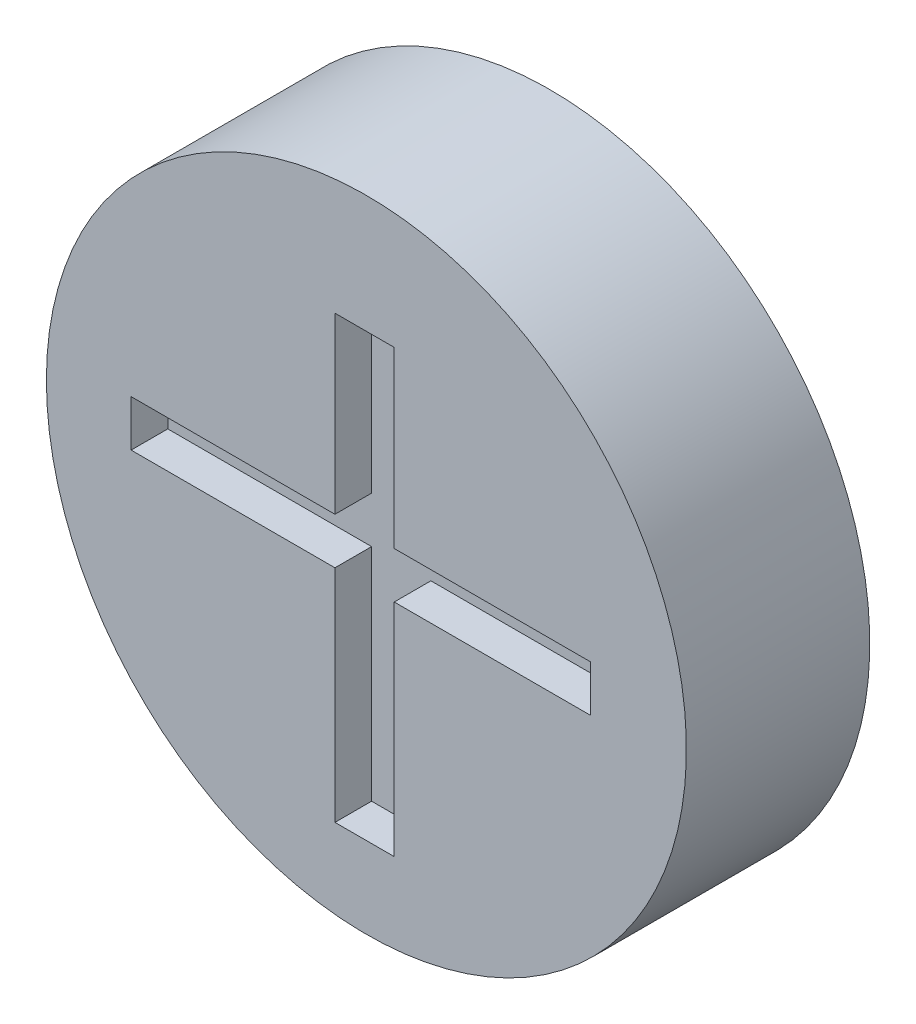
ISO-10303-21;
HEADER;
FILE_DESCRIPTION(('STEP AP214'),'2;1');
FILE_NAME('part.step','',(''),(''),'','','');
FILE_SCHEMA(('AUTOMOTIVE_DESIGN { 1 0 10303 214 1 1 1 1 }'));
ENDSEC;
DATA;
#1=APPLICATION_CONTEXT('core data for automotive mechanical design processes');
#2=APPLICATION_PROTOCOL_DEFINITION('international standard','automotive_design',2000,#1);
#3=PRODUCT_CONTEXT('',#1,'mechanical');
#4=PRODUCT('Part','Part','',(#3));
#5=PRODUCT_RELATED_PRODUCT_CATEGORY('part','',(#4));
#6=PRODUCT_DEFINITION_FORMATION('','',#4);
#7=PRODUCT_DEFINITION_CONTEXT('part definition',#1,'design');
#8=PRODUCT_DEFINITION('design','',#6,#7);
#9=PRODUCT_DEFINITION_SHAPE('','',#8);
#10=(LENGTH_UNIT() NAMED_UNIT(*) SI_UNIT(.MILLI.,.METRE.));
#11=(NAMED_UNIT(*) PLANE_ANGLE_UNIT() SI_UNIT($,.RADIAN.));
#12=(NAMED_UNIT(*) SI_UNIT($,.STERADIAN.) SOLID_ANGLE_UNIT());
#13=UNCERTAINTY_MEASURE_WITH_UNIT(LENGTH_MEASURE(1.E-05),#10,'distance_accuracy_value','');
#14=(GEOMETRIC_REPRESENTATION_CONTEXT(3) GLOBAL_UNCERTAINTY_ASSIGNED_CONTEXT((#13)) GLOBAL_UNIT_ASSIGNED_CONTEXT((#10,
#11,#12)) REPRESENTATION_CONTEXT('',''));
#15=CARTESIAN_POINT('',(0.,0.,0.));
#16=DIRECTION('',(0.,0.,1.));
#17=DIRECTION('',(1.,0.,0.));
#18=AXIS2_PLACEMENT_3D('',#15,#16,#17);
#19=CARTESIAN_POINT('',(-1.283068530003,-0.09947694086345,4.5));
#20=DIRECTION('',(-1.,0.,0.));
#21=DIRECTION('',(0.,1.,0.));
#22=AXIS2_PLACEMENT_3D('',#19,#20,#21);
#23=PLANE('',#22);
#24=DIRECTION('',(0.,1.,0.));
#25=VECTOR('',#24,1.);
#26=CARTESIAN_POINT('',(-1.283068530003,-0.04973847043172,4.5));
#27=LINE('',#26,#25);
#28=CARTESIAN_POINT('',(-1.283068530003,-0.09947694086345,4.5));
#29=VERTEX_POINT('',#28);
#30=CARTESIAN_POINT('',(-1.283068530003,0.153132863301,4.5));
#31=VERTEX_POINT('',#30);
#32=EDGE_CURVE('E35',#29,#31,#27,.T.);
#33=ORIENTED_EDGE('',*,*,#32,.F.);
#34=DIRECTION('',(0.,0.,-1.));
#35=VECTOR('',#34,1.);
#36=CARTESIAN_POINT('',(-1.283068530003,-0.09947694086345,4.5));
#37=LINE('',#36,#35);
#38=CARTESIAN_POINT('',(-1.283068530003,-0.09947694086345,4.3));
#39=VERTEX_POINT('',#38);
#40=EDGE_CURVE('E11',#29,#39,#37,.T.);
#41=ORIENTED_EDGE('',*,*,#40,.T.);
#42=DIRECTION('',(0.,1.,0.));
#43=VECTOR('',#42,1.);
#44=CARTESIAN_POINT('',(-1.283068530003,-0.09947694086345,4.3));
#45=LINE('',#44,#43);
#46=CARTESIAN_POINT('',(-1.283068530003,0.153132863301,4.3));
#47=VERTEX_POINT('',#46);
#48=EDGE_CURVE('E27',#39,#47,#45,.T.);
#49=ORIENTED_EDGE('',*,*,#48,.T.);
#50=DIRECTION('',(0.,0.,-1.));
#51=VECTOR('',#50,1.);
#52=CARTESIAN_POINT('',(-1.283068530003,0.153132863301,4.5));
#53=LINE('',#52,#51);
#54=EDGE_CURVE('E118',#31,#47,#53,.T.);
#55=ORIENTED_EDGE('',*,*,#54,.F.);
#56=EDGE_LOOP('',(#33,#41,#49,#55));
#57=FACE_BOUND('',#56,.T.);
#58=ADVANCED_FACE('F17',(#57),#23,.F.);
#59=CARTESIAN_POINT('',(-0.17158539168,-0.09947694086345,4.5));
#60=DIRECTION('',(0.,-1.,0.));
#61=DIRECTION('',(-1.,0.,0.));
#62=AXIS2_PLACEMENT_3D('',#59,#60,#61);
#63=PLANE('',#62);
#64=DIRECTION('',(-1.,0.,0.));
#65=VECTOR('',#64,1.);
#66=CARTESIAN_POINT('',(-0.08579269584008,-0.09947694086345,4.5));
#67=LINE('',#66,#65);
#68=CARTESIAN_POINT('',(-0.17158539168,-0.09947694086345,4.5));
#69=VERTEX_POINT('',#68);
#70=EDGE_CURVE('E134',#69,#29,#67,.T.);
#71=ORIENTED_EDGE('',*,*,#70,.F.);
#72=DIRECTION('',(0.,0.,-1.));
#73=VECTOR('',#72,1.);
#74=CARTESIAN_POINT('',(-0.17158539168,-0.09947694086345,4.5));
#75=LINE('',#74,#73);
#76=CARTESIAN_POINT('',(-0.17158539168,-0.09947694086345,4.3));
#77=VERTEX_POINT('',#76);
#78=EDGE_CURVE('E146',#69,#77,#75,.T.);
#79=ORIENTED_EDGE('',*,*,#78,.T.);
#80=DIRECTION('',(-1.,0.,0.));
#81=VECTOR('',#80,1.);
#82=CARTESIAN_POINT('',(-0.17158539168,-0.09947694086345,4.3));
#83=LINE('',#82,#81);
#84=EDGE_CURVE('E149',#77,#39,#83,.T.);
#85=ORIENTED_EDGE('',*,*,#84,.T.);
#86=ORIENTED_EDGE('',*,*,#40,.F.);
#87=EDGE_LOOP('',(#71,#79,#85,#86));
#88=FACE_BOUND('',#87,.T.);
#89=ADVANCED_FACE('F220',(#88),#63,.F.);
#90=CARTESIAN_POINT('',(-0.17158539168,-1.301899608685,4.5));
#91=DIRECTION('',(-1.,0.,0.));
#92=DIRECTION('',(0.,1.,0.));
#93=AXIS2_PLACEMENT_3D('',#90,#91,#92);
#94=PLANE('',#93);
#95=DIRECTION('',(0.,1.,0.));
#96=VECTOR('',#95,1.);
#97=CARTESIAN_POINT('',(-0.17158539168,-0.650949804342,4.5));
#98=LINE('',#97,#96);
#99=CARTESIAN_POINT('',(-0.17158539168,-1.301899608685,4.5));
#100=VERTEX_POINT('',#99);
#101=EDGE_CURVE('E138',#100,#69,#98,.T.);
#102=ORIENTED_EDGE('',*,*,#101,.F.);
#103=DIRECTION('',(0.,0.,-1.));
#104=VECTOR('',#103,1.);
#105=CARTESIAN_POINT('',(-0.17158539168,-1.301899608685,4.5));
#106=LINE('',#105,#104);
#107=CARTESIAN_POINT('',(-0.17158539168,-1.301899608685,4.3));
#108=VERTEX_POINT('',#107);
#109=EDGE_CURVE('E151',#100,#108,#106,.T.);
#110=ORIENTED_EDGE('',*,*,#109,.T.);
#111=DIRECTION('',(0.,1.,0.));
#112=VECTOR('',#111,1.);
#113=CARTESIAN_POINT('',(-0.17158539168,-1.301899608685,4.3));
#114=LINE('',#113,#112);
#115=EDGE_CURVE('E155',#108,#77,#114,.T.);
#116=ORIENTED_EDGE('',*,*,#115,.T.);
#117=ORIENTED_EDGE('',*,*,#78,.F.);
#118=EDGE_LOOP('',(#102,#110,#116,#117));
#119=FACE_BOUND('',#118,.T.);
#120=ADVANCED_FACE('F222',(#119),#94,.F.);
#121=CARTESIAN_POINT('',(0.15175515765,-1.301899608685,4.5));
#122=DIRECTION('',(0.,-1.,0.));
#123=DIRECTION('',(-1.,0.,0.));
#124=AXIS2_PLACEMENT_3D('',#121,#122,#123);
#125=PLANE('',#124);
#126=DIRECTION('',(-1.,0.,0.));
#127=VECTOR('',#126,1.);
#128=CARTESIAN_POINT('',(0.075877578825,-1.301899608685,4.5));
#129=LINE('',#128,#127);
#130=CARTESIAN_POINT('',(0.15175515765,-1.301899608685,4.5));
#131=VERTEX_POINT('',#130);
#132=EDGE_CURVE('E142',#131,#100,#129,.T.);
#133=ORIENTED_EDGE('',*,*,#132,.F.);
#134=DIRECTION('',(0.,0.,-1.));
#135=VECTOR('',#134,1.);
#136=CARTESIAN_POINT('',(0.15175515765,-1.301899608685,4.5));
#137=LINE('',#136,#135);
#138=CARTESIAN_POINT('',(0.15175515765,-1.301899608685,4.3));
#139=VERTEX_POINT('',#138);
#140=EDGE_CURVE('E158',#131,#139,#137,.T.);
#141=ORIENTED_EDGE('',*,*,#140,.T.);
#142=DIRECTION('',(-1.,0.,0.));
#143=VECTOR('',#142,1.);
#144=CARTESIAN_POINT('',(0.15175515765,-1.301899608685,4.3));
#145=LINE('',#144,#143);
#146=EDGE_CURVE('E164',#139,#108,#145,.T.);
#147=ORIENTED_EDGE('',*,*,#146,.T.);
#148=ORIENTED_EDGE('',*,*,#109,.F.);
#149=EDGE_LOOP('',(#133,#141,#147,#148));
#150=FACE_BOUND('',#149,.T.);
#151=ADVANCED_FACE('F225',(#150),#125,.F.);
#152=CARTESIAN_POINT('',(0.15175515765,-0.09947694086345,4.5));
#153=DIRECTION('',(1.,0.,0.));
#154=DIRECTION('',(0.,-1.,0.));
#155=AXIS2_PLACEMENT_3D('',#152,#153,#154);
#156=PLANE('',#155);
#157=DIRECTION('',(0.,-1.,0.));
#158=VECTOR('',#157,1.);
#159=CARTESIAN_POINT('',(0.15175515765,-0.04973847043172,4.5));
#160=LINE('',#159,#158);
#161=CARTESIAN_POINT('',(0.15175515765,-0.09947694086345,4.5));
#162=VERTEX_POINT('',#161);
#163=EDGE_CURVE('E161',#162,#131,#160,.T.);
#164=ORIENTED_EDGE('',*,*,#163,.F.);
#165=DIRECTION('',(0.,0.,-1.));
#166=VECTOR('',#165,1.);
#167=CARTESIAN_POINT('',(0.15175515765,-0.09947694086345,4.5));
#168=LINE('',#167,#166);
#169=CARTESIAN_POINT('',(0.15175515765,-0.09947694086345,4.3));
#170=VERTEX_POINT('',#169);
#171=EDGE_CURVE('E167',#162,#170,#168,.T.);
#172=ORIENTED_EDGE('',*,*,#171,.T.);
#173=DIRECTION('',(0.,-1.,0.));
#174=VECTOR('',#173,1.);
#175=CARTESIAN_POINT('',(0.15175515765,-0.09947694086345,4.3));
#176=LINE('',#175,#174);
#177=EDGE_CURVE('E173',#170,#139,#176,.T.);
#178=ORIENTED_EDGE('',*,*,#177,.T.);
#179=ORIENTED_EDGE('',*,*,#140,.F.);
#180=EDGE_LOOP('',(#164,#172,#178,#179));
#181=FACE_BOUND('',#180,.T.);
#182=ADVANCED_FACE('F229',(#181),#156,.F.);
#183=CARTESIAN_POINT('',(1.222820727306,-0.09947694086345,4.5));
#184=DIRECTION('',(0.,-1.,0.));
#185=DIRECTION('',(-1.,0.,0.));
#186=AXIS2_PLACEMENT_3D('',#183,#184,#185);
#187=PLANE('',#186);
#188=DIRECTION('',(-1.,0.,0.));
#189=VECTOR('',#188,1.);
#190=CARTESIAN_POINT('',(0.611410363653,-0.09947694086345,4.5));
#191=LINE('',#190,#189);
#192=CARTESIAN_POINT('',(1.222820727306,-0.09947694086345,4.5));
#193=VERTEX_POINT('',#192);
#194=EDGE_CURVE('E170',#193,#162,#191,.T.);
#195=ORIENTED_EDGE('',*,*,#194,.F.);
#196=DIRECTION('',(0.,0.,-1.));
#197=VECTOR('',#196,1.);
#198=CARTESIAN_POINT('',(1.222820727306,-0.09947694086345,4.5));
#199=LINE('',#198,#197);
#200=CARTESIAN_POINT('',(1.222820727306,-0.09947694086345,4.3));
#201=VERTEX_POINT('',#200);
#202=EDGE_CURVE('E176',#193,#201,#199,.T.);
#203=ORIENTED_EDGE('',*,*,#202,.T.);
#204=DIRECTION('',(-1.,0.,0.));
#205=VECTOR('',#204,1.);
#206=CARTESIAN_POINT('',(1.222820727306,-0.09947694086345,4.3));
#207=LINE('',#206,#205);
#208=EDGE_CURVE('E182',#201,#170,#207,.T.);
#209=ORIENTED_EDGE('',*,*,#208,.T.);
#210=ORIENTED_EDGE('',*,*,#171,.F.);
#211=EDGE_LOOP('',(#195,#203,#209,#210));
#212=FACE_BOUND('',#211,.T.);
#213=ADVANCED_FACE('F231',(#212),#187,.F.);
#214=CARTESIAN_POINT('',(1.222820727306,0.153132863301,4.5));
#215=DIRECTION('',(1.,0.,0.));
#216=DIRECTION('',(0.,-1.,0.));
#217=AXIS2_PLACEMENT_3D('',#214,#215,#216);
#218=PLANE('',#217);
#219=DIRECTION('',(0.,-1.,0.));
#220=VECTOR('',#219,1.);
#221=CARTESIAN_POINT('',(1.222820727306,0.07656643165037,4.5));
#222=LINE('',#221,#220);
#223=CARTESIAN_POINT('',(1.222820727306,0.153132863301,4.5));
#224=VERTEX_POINT('',#223);
#225=EDGE_CURVE('E179',#224,#193,#222,.T.);
#226=ORIENTED_EDGE('',*,*,#225,.F.);
#227=DIRECTION('',(0.,0.,-1.));
#228=VECTOR('',#227,1.);
#229=CARTESIAN_POINT('',(1.222820727306,0.153132863301,4.5));
#230=LINE('',#229,#228);
#231=CARTESIAN_POINT('',(1.222820727306,0.153132863301,4.3));
#232=VERTEX_POINT('',#231);
#233=EDGE_CURVE('E185',#224,#232,#230,.T.);
#234=ORIENTED_EDGE('',*,*,#233,.T.);
#235=DIRECTION('',(0.,-1.,0.));
#236=VECTOR('',#235,1.);
#237=CARTESIAN_POINT('',(1.222820727306,0.153132863301,4.3));
#238=LINE('',#237,#236);
#239=EDGE_CURVE('E191',#232,#201,#238,.T.);
#240=ORIENTED_EDGE('',*,*,#239,.T.);
#241=ORIENTED_EDGE('',*,*,#202,.F.);
#242=EDGE_LOOP('',(#226,#234,#240,#241));
#243=FACE_BOUND('',#242,.T.);
#244=ADVANCED_FACE('F234',(#243),#218,.F.);
#245=CARTESIAN_POINT('',(0.15175515765,0.153132863301,4.5));
#246=DIRECTION('',(0.,1.,0.));
#247=DIRECTION('',(1.,0.,0.));
#248=AXIS2_PLACEMENT_3D('',#245,#246,#247);
#249=PLANE('',#248);
#250=DIRECTION('',(1.,0.,0.));
#251=VECTOR('',#250,1.);
#252=CARTESIAN_POINT('',(0.075877578825,0.153132863301,4.5));
#253=LINE('',#252,#251);
#254=CARTESIAN_POINT('',(0.15175515765,0.153132863301,4.5));
#255=VERTEX_POINT('',#254);
#256=EDGE_CURVE('E188',#255,#224,#253,.T.);
#257=ORIENTED_EDGE('',*,*,#256,.F.);
#258=DIRECTION('',(0.,0.,-1.));
#259=VECTOR('',#258,1.);
#260=CARTESIAN_POINT('',(0.15175515765,0.153132863301,4.5));
#261=LINE('',#260,#259);
#262=CARTESIAN_POINT('',(0.15175515765,0.153132863301,4.3));
#263=VERTEX_POINT('',#262);
#264=EDGE_CURVE('E194',#255,#263,#261,.T.);
#265=ORIENTED_EDGE('',*,*,#264,.T.);
#266=DIRECTION('',(1.,0.,0.));
#267=VECTOR('',#266,1.);
#268=CARTESIAN_POINT('',(0.15175515765,0.153132863301,4.3));
#269=LINE('',#268,#267);
#270=EDGE_CURVE('E200',#263,#232,#269,.T.);
#271=ORIENTED_EDGE('',*,*,#270,.T.);
#272=ORIENTED_EDGE('',*,*,#233,.F.);
#273=EDGE_LOOP('',(#257,#265,#271,#272));
#274=FACE_BOUND('',#273,.T.);
#275=ADVANCED_FACE('F238',(#274),#249,.F.);
#276=CARTESIAN_POINT('',(0.15175515765,1.102945726958,4.5));
#277=DIRECTION('',(1.,0.,0.));
#278=DIRECTION('',(0.,-1.,0.));
#279=AXIS2_PLACEMENT_3D('',#276,#277,#278);
#280=PLANE('',#279);
#281=DIRECTION('',(0.,-1.,0.));
#282=VECTOR('',#281,1.);
#283=CARTESIAN_POINT('',(0.15175515765,0.551472863479,4.5));
#284=LINE('',#283,#282);
#285=CARTESIAN_POINT('',(0.15175515765,1.102945726958,4.5));
#286=VERTEX_POINT('',#285);
#287=EDGE_CURVE('E197',#286,#255,#284,.T.);
#288=ORIENTED_EDGE('',*,*,#287,.F.);
#289=DIRECTION('',(0.,0.,-1.));
#290=VECTOR('',#289,1.);
#291=CARTESIAN_POINT('',(0.15175515765,1.102945726958,4.5));
#292=LINE('',#291,#290);
#293=CARTESIAN_POINT('',(0.15175515765,1.102945726958,4.3));
#294=VERTEX_POINT('',#293);
#295=EDGE_CURVE('E203',#286,#294,#292,.T.);
#296=ORIENTED_EDGE('',*,*,#295,.T.);
#297=DIRECTION('',(0.,-1.,0.));
#298=VECTOR('',#297,1.);
#299=CARTESIAN_POINT('',(0.15175515765,1.102945726958,4.3));
#300=LINE('',#299,#298);
#301=EDGE_CURVE('E209',#294,#263,#300,.T.);
#302=ORIENTED_EDGE('',*,*,#301,.T.);
#303=ORIENTED_EDGE('',*,*,#264,.F.);
#304=EDGE_LOOP('',(#288,#296,#302,#303));
#305=FACE_BOUND('',#304,.T.);
#306=ADVANCED_FACE('F240',(#305),#280,.F.);
#307=CARTESIAN_POINT('',(-0.17158539168,1.102945726958,4.5));
#308=DIRECTION('',(0.,1.,0.));
#309=DIRECTION('',(1.,0.,0.));
#310=AXIS2_PLACEMENT_3D('',#307,#308,#309);
#311=PLANE('',#310);
#312=DIRECTION('',(1.,0.,0.));
#313=VECTOR('',#312,1.);
#314=CARTESIAN_POINT('',(-0.08579269584008,1.102945726958,4.5));
#315=LINE('',#314,#313);
#316=CARTESIAN_POINT('',(-0.17158539168,1.102945726958,4.5));
#317=VERTEX_POINT('',#316);
#318=EDGE_CURVE('E206',#317,#286,#315,.T.);
#319=ORIENTED_EDGE('',*,*,#318,.F.);
#320=DIRECTION('',(0.,0.,-1.));
#321=VECTOR('',#320,1.);
#322=CARTESIAN_POINT('',(-0.17158539168,1.102945726958,4.5));
#323=LINE('',#322,#321);
#324=CARTESIAN_POINT('',(-0.17158539168,1.102945726958,4.3));
#325=VERTEX_POINT('',#324);
#326=EDGE_CURVE('E212',#317,#325,#323,.T.);
#327=ORIENTED_EDGE('',*,*,#326,.T.);
#328=DIRECTION('',(1.,0.,0.));
#329=VECTOR('',#328,1.);
#330=CARTESIAN_POINT('',(-0.17158539168,1.102945726958,4.3));
#331=LINE('',#330,#329);
#332=EDGE_CURVE('E115',#325,#294,#331,.T.);
#333=ORIENTED_EDGE('',*,*,#332,.T.);
#334=ORIENTED_EDGE('',*,*,#295,.F.);
#335=EDGE_LOOP('',(#319,#327,#333,#334));
#336=FACE_BOUND('',#335,.T.);
#337=ADVANCED_FACE('F243',(#336),#311,.F.);
#338=CARTESIAN_POINT('',(-0.17158539168,0.153132863301,4.5));
#339=DIRECTION('',(-1.,0.,0.));
#340=DIRECTION('',(0.,1.,0.));
#341=AXIS2_PLACEMENT_3D('',#338,#339,#340);
#342=PLANE('',#341);
#343=DIRECTION('',(0.,1.,0.));
#344=VECTOR('',#343,1.);
#345=CARTESIAN_POINT('',(-0.17158539168,0.07656643165037,4.5));
#346=LINE('',#345,#344);
#347=CARTESIAN_POINT('',(-0.17158539168,0.153132863301,4.5));
#348=VERTEX_POINT('',#347);
#349=EDGE_CURVE('E104',#348,#317,#346,.T.);
#350=ORIENTED_EDGE('',*,*,#349,.F.);
#351=DIRECTION('',(0.,0.,-1.));
#352=VECTOR('',#351,1.);
#353=CARTESIAN_POINT('',(-0.17158539168,0.153132863301,4.5));
#354=LINE('',#353,#352);
#355=CARTESIAN_POINT('',(-0.17158539168,0.153132863301,4.3));
#356=VERTEX_POINT('',#355);
#357=EDGE_CURVE('E117',#348,#356,#354,.T.);
#358=ORIENTED_EDGE('',*,*,#357,.T.);
#359=DIRECTION('',(0.,1.,0.));
#360=VECTOR('',#359,1.);
#361=CARTESIAN_POINT('',(-0.17158539168,0.153132863301,4.3));
#362=LINE('',#361,#360);
#363=EDGE_CURVE('E110',#356,#325,#362,.T.);
#364=ORIENTED_EDGE('',*,*,#363,.T.);
#365=ORIENTED_EDGE('',*,*,#326,.F.);
#366=EDGE_LOOP('',(#350,#358,#364,#365));
#367=FACE_BOUND('',#366,.T.);
#368=ADVANCED_FACE('F120',(#367),#342,.F.);
#369=CARTESIAN_POINT('',(-1.283068530003,0.153132863301,4.5));
#370=DIRECTION('',(0.,1.,0.));
#371=DIRECTION('',(1.,0.,0.));
#372=AXIS2_PLACEMENT_3D('',#369,#370,#371);
#373=PLANE('',#372);
#374=DIRECTION('',(1.,0.,0.));
#375=VECTOR('',#374,1.);
#376=CARTESIAN_POINT('',(-0.641534265001,0.153132863301,4.5));
#377=LINE('',#376,#375);
#378=EDGE_CURVE('E131',#31,#348,#377,.T.);
#379=ORIENTED_EDGE('',*,*,#378,.F.);
#380=ORIENTED_EDGE('',*,*,#54,.T.);
#381=DIRECTION('',(1.,0.,0.));
#382=VECTOR('',#381,1.);
#383=CARTESIAN_POINT('',(-1.283068530003,0.153132863301,4.3));
#384=LINE('',#383,#382);
#385=EDGE_CURVE('E113',#47,#356,#384,.T.);
#386=ORIENTED_EDGE('',*,*,#385,.T.);
#387=ORIENTED_EDGE('',*,*,#357,.F.);
#388=EDGE_LOOP('',(#379,#380,#386,#387));
#389=FACE_BOUND('',#388,.T.);
#390=ADVANCED_FACE('F125',(#389),#373,.F.);
#391=CARTESIAN_POINT('',(-0.03012390134821,-0.09947694086345,4.3));
#392=DIRECTION('',(0.,0.,-1.));
#393=DIRECTION('',(-1.,0.,0.));
#394=AXIS2_PLACEMENT_3D('',#391,#392,#393);
#395=PLANE('',#394);
#396=ORIENTED_EDGE('',*,*,#385,.F.);
#397=ORIENTED_EDGE('',*,*,#48,.F.);
#398=ORIENTED_EDGE('',*,*,#84,.F.);
#399=ORIENTED_EDGE('',*,*,#115,.F.);
#400=ORIENTED_EDGE('',*,*,#146,.F.);
#401=ORIENTED_EDGE('',*,*,#177,.F.);
#402=ORIENTED_EDGE('',*,*,#208,.F.);
#403=ORIENTED_EDGE('',*,*,#239,.F.);
#404=ORIENTED_EDGE('',*,*,#270,.F.);
#405=ORIENTED_EDGE('',*,*,#301,.F.);
#406=ORIENTED_EDGE('',*,*,#332,.F.);
#407=ORIENTED_EDGE('',*,*,#363,.F.);
#408=EDGE_LOOP('',(#396,#397,#398,#399,#400,#401,#402,#403,#404,#405,#406,#407));
#409=FACE_BOUND('',#408,.T.);
#410=ADVANCED_FACE('F111',(#409),#395,.F.);
#411=CARTESIAN_POINT('',(0.,0.,4.5));
#412=DIRECTION('',(0.,0.,-1.));
#413=DIRECTION('',(-1.,0.,0.));
#414=AXIS2_PLACEMENT_3D('',#411,#412,#413);
#415=CYLINDRICAL_SURFACE('',#414,1.745101114406);
#416=CARTESIAN_POINT('',(0.,0.,4.5));
#417=DIRECTION('',(0.,0.,1.));
#418=DIRECTION('',(-1.,0.,0.));
#419=AXIS2_PLACEMENT_3D('',#416,#417,#418);
#420=CIRCLE('',#419,1.745101114406);
#421=CARTESIAN_POINT('',(-1.745101114406,0.,4.5));
#422=VERTEX_POINT('',#421);
#423=EDGE_CURVE('E21',#422,#422,#420,.T.);
#424=ORIENTED_EDGE('',*,*,#423,.F.);
#425=EDGE_LOOP('',(#424));
#426=FACE_BOUND('',#425,.T.);
#427=CARTESIAN_POINT('',(0.,0.,3.5));
#428=DIRECTION('',(0.,0.,-1.));
#429=DIRECTION('',(-1.,0.,0.));
#430=AXIS2_PLACEMENT_3D('',#427,#428,#429);
#431=CIRCLE('',#430,1.745101114406);
#432=CARTESIAN_POINT('',(-1.745101114406,0.,3.5));
#433=VERTEX_POINT('',#432);
#434=EDGE_CURVE('E132',#433,#433,#431,.T.);
#435=ORIENTED_EDGE('',*,*,#434,.F.);
#436=EDGE_LOOP('',(#435));
#437=FACE_BOUND('',#436,.T.);
#438=ADVANCED_FACE('F246',(#426,#437),#415,.T.);
#439=CARTESIAN_POINT('',(0.,0.,4.5));
#440=DIRECTION('',(0.,0.,1.));
#441=DIRECTION('',(-1.,0.,0.));
#442=AXIS2_PLACEMENT_3D('',#439,#440,#441);
#443=PLANE('',#442);
#444=ORIENTED_EDGE('',*,*,#423,.T.);
#445=EDGE_LOOP('',(#444));
#446=FACE_BOUND('',#445,.T.);
#447=ORIENTED_EDGE('',*,*,#32,.T.);
#448=ORIENTED_EDGE('',*,*,#378,.T.);
#449=ORIENTED_EDGE('',*,*,#349,.T.);
#450=ORIENTED_EDGE('',*,*,#318,.T.);
#451=ORIENTED_EDGE('',*,*,#287,.T.);
#452=ORIENTED_EDGE('',*,*,#256,.T.);
#453=ORIENTED_EDGE('',*,*,#225,.T.);
#454=ORIENTED_EDGE('',*,*,#194,.T.);
#455=ORIENTED_EDGE('',*,*,#163,.T.);
#456=ORIENTED_EDGE('',*,*,#132,.T.);
#457=ORIENTED_EDGE('',*,*,#101,.T.);
#458=ORIENTED_EDGE('',*,*,#70,.T.);
#459=EDGE_LOOP('',(#447,#448,#449,#450,#451,#452,#453,#454,#455,#456,#457,#458));
#460=FACE_BOUND('',#459,.T.);
#461=ADVANCED_FACE('F244',(#446,#460),#443,.T.);
#462=CARTESIAN_POINT('',(0.,0.,3.5));
#463=DIRECTION('',(0.,0.,1.));
#464=DIRECTION('',(-1.,0.,0.));
#465=AXIS2_PLACEMENT_3D('',#462,#463,#464);
#466=PLANE('',#465);
#467=ORIENTED_EDGE('',*,*,#434,.T.);
#468=EDGE_LOOP('',(#467));
#469=FACE_BOUND('',#468,.T.);
#470=ADVANCED_FACE('F19',(#469),#466,.F.);
#471=CLOSED_SHELL('',(#58,#89,#120,#151,#182,#213,#244,#275,#306,#337,#368,#390,#410,#438,#461,#470));
#472=MANIFOLD_SOLID_BREP('B1',#471);
#473=ADVANCED_BREP_SHAPE_REPRESENTATION('',(#18,#472),#14);
#474=SHAPE_DEFINITION_REPRESENTATION(#9,#473);
ENDSEC;
END-ISO-10303-21;
